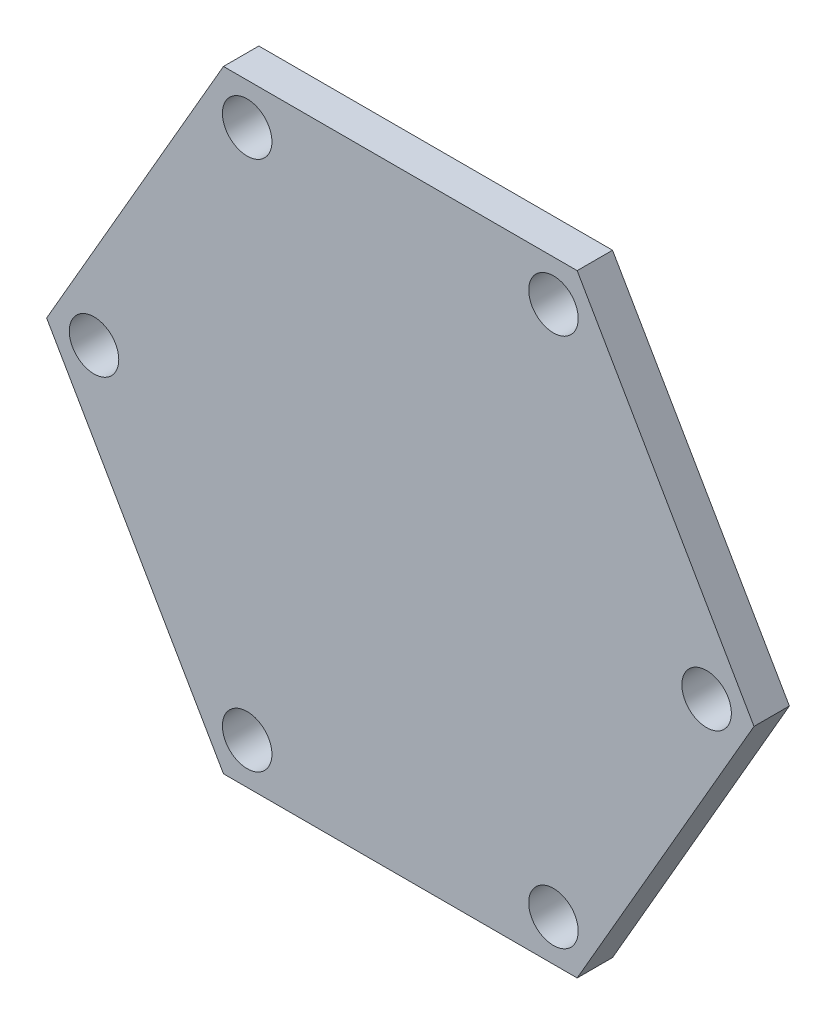
ISO-10303-21;
HEADER;
FILE_DESCRIPTION(('STEP AP214'),'2;1');
FILE_NAME('part.step','',(''),(''),'','','');
FILE_SCHEMA(('AUTOMOTIVE_DESIGN { 1 0 10303 214 1 1 1 1 }'));
ENDSEC;
DATA;
#1=APPLICATION_CONTEXT('core data for automotive mechanical design processes');
#2=APPLICATION_PROTOCOL_DEFINITION('international standard','automotive_design',2000,#1);
#3=PRODUCT_CONTEXT('',#1,'mechanical');
#4=PRODUCT('Part','Part','',(#3));
#5=PRODUCT_RELATED_PRODUCT_CATEGORY('part','',(#4));
#6=PRODUCT_DEFINITION_FORMATION('','',#4);
#7=PRODUCT_DEFINITION_CONTEXT('part definition',#1,'design');
#8=PRODUCT_DEFINITION('design','',#6,#7);
#9=PRODUCT_DEFINITION_SHAPE('','',#8);
#10=(LENGTH_UNIT() NAMED_UNIT(*) SI_UNIT(.MILLI.,.METRE.));
#11=(NAMED_UNIT(*) PLANE_ANGLE_UNIT() SI_UNIT($,.RADIAN.));
#12=(NAMED_UNIT(*) SI_UNIT($,.STERADIAN.) SOLID_ANGLE_UNIT());
#13=UNCERTAINTY_MEASURE_WITH_UNIT(LENGTH_MEASURE(1.E-05),#10,'distance_accuracy_value','');
#14=(GEOMETRIC_REPRESENTATION_CONTEXT(3) GLOBAL_UNCERTAINTY_ASSIGNED_CONTEXT((#13)) GLOBAL_UNIT_ASSIGNED_CONTEXT((#10,
#11,#12)) REPRESENTATION_CONTEXT('',''));
#15=CARTESIAN_POINT('',(0.,0.,0.));
#16=DIRECTION('',(0.,0.,1.));
#17=DIRECTION('',(1.,0.,0.));
#18=AXIS2_PLACEMENT_3D('',#15,#16,#17);
#19=CARTESIAN_POINT('',(0.,0.,10.));
#20=DIRECTION('',(0.,0.,1.));
#21=DIRECTION('',(1.,0.,0.));
#22=AXIS2_PLACEMENT_3D('',#19,#20,#21);
#23=PLANE('',#22);
#24=CARTESIAN_POINT('',(-43.3012701892219,-75.0000000000001,10.));
#25=DIRECTION('',(0.,0.,1.));
#26=DIRECTION('',(1.,0.,0.));
#27=AXIS2_PLACEMENT_3D('',#24,#25,#26);
#28=CIRCLE('',#27,7.);
#29=CARTESIAN_POINT('',(-36.3012701892219,-75.0000000000001,10.));
#30=VERTEX_POINT('',#29);
#31=EDGE_CURVE('E196',#30,#30,#28,.T.);
#32=ORIENTED_EDGE('',*,*,#31,.F.);
#33=EDGE_LOOP('',(#32));
#34=FACE_BOUND('',#33,.T.);
#35=CARTESIAN_POINT('',(86.6025403784439,0.,10.));
#36=DIRECTION('',(0.,0.,1.));
#37=DIRECTION('',(1.,0.,0.));
#38=AXIS2_PLACEMENT_3D('',#35,#36,#37);
#39=CIRCLE('',#38,7.);
#40=CARTESIAN_POINT('',(93.6025403784439,0.,10.));
#41=VERTEX_POINT('',#40);
#42=EDGE_CURVE('E208',#41,#41,#39,.T.);
#43=ORIENTED_EDGE('',*,*,#42,.F.);
#44=EDGE_LOOP('',(#43));
#45=FACE_BOUND('',#44,.T.);
#46=CARTESIAN_POINT('',(-43.301270189222,75.,10.));
#47=DIRECTION('',(0.,0.,1.));
#48=DIRECTION('',(1.,0.,0.));
#49=AXIS2_PLACEMENT_3D('',#46,#47,#48);
#50=CIRCLE('',#49,7.);
#51=CARTESIAN_POINT('',(-36.301270189222,75.,10.));
#52=VERTEX_POINT('',#51);
#53=EDGE_CURVE('E121',#52,#52,#50,.T.);
#54=ORIENTED_EDGE('',*,*,#53,.F.);
#55=EDGE_LOOP('',(#54));
#56=FACE_BOUND('',#55,.T.);
#57=DIRECTION('',(-0.5,0.866025403784438,0.));
#58=VECTOR('',#57,1.);
#59=CARTESIAN_POINT('',(100.,0.,10.));
#60=LINE('',#59,#58);
#61=CARTESIAN_POINT('',(100.,0.,10.));
#62=VERTEX_POINT('',#61);
#63=CARTESIAN_POINT('',(50.,86.6025403784439,10.));
#64=VERTEX_POINT('',#63);
#65=EDGE_CURVE('E128',#62,#64,#60,.T.);
#66=ORIENTED_EDGE('',*,*,#65,.T.);
#67=DIRECTION('',(-1.,0.,0.));
#68=VECTOR('',#67,1.);
#69=CARTESIAN_POINT('',(50.,86.6025403784439,10.));
#70=LINE('',#69,#68);
#71=CARTESIAN_POINT('',(-50.,86.6025403784439,10.));
#72=VERTEX_POINT('',#71);
#73=EDGE_CURVE('E86',#64,#72,#70,.T.);
#74=ORIENTED_EDGE('',*,*,#73,.T.);
#75=DIRECTION('',(-0.5,-0.866025403784439,0.));
#76=VECTOR('',#75,1.);
#77=CARTESIAN_POINT('',(-50.,86.6025403784439,10.));
#78=LINE('',#77,#76);
#79=CARTESIAN_POINT('',(-100.,0.,10.));
#80=VERTEX_POINT('',#79);
#81=EDGE_CURVE('E99',#72,#80,#78,.T.);
#82=ORIENTED_EDGE('',*,*,#81,.T.);
#83=DIRECTION('',(0.5,-0.866025403784438,0.));
#84=VECTOR('',#83,1.);
#85=CARTESIAN_POINT('',(-100.,0.,10.));
#86=LINE('',#85,#84);
#87=CARTESIAN_POINT('',(-50.,-86.6025403784439,10.));
#88=VERTEX_POINT('',#87);
#89=EDGE_CURVE('E93',#80,#88,#86,.T.);
#90=ORIENTED_EDGE('',*,*,#89,.T.);
#91=DIRECTION('',(1.,0.,0.));
#92=VECTOR('',#91,1.);
#93=CARTESIAN_POINT('',(-50.,-86.6025403784439,10.));
#94=LINE('',#93,#92);
#95=CARTESIAN_POINT('',(50.,-86.6025403784439,10.));
#96=VERTEX_POINT('',#95);
#97=EDGE_CURVE('E97',#88,#96,#94,.T.);
#98=ORIENTED_EDGE('',*,*,#97,.T.);
#99=DIRECTION('',(0.5,0.866025403784439,0.));
#100=VECTOR('',#99,1.);
#101=CARTESIAN_POINT('',(50.,-86.6025403784439,10.));
#102=LINE('',#101,#100);
#103=EDGE_CURVE('E49',#96,#62,#102,.T.);
#104=ORIENTED_EDGE('',*,*,#103,.T.);
#105=EDGE_LOOP('',(#66,#74,#82,#90,#98,#104));
#106=FACE_BOUND('',#105,.T.);
#107=CARTESIAN_POINT('',(43.3012701892219,75.,10.));
#108=DIRECTION('',(0.,0.,1.));
#109=DIRECTION('',(1.,0.,0.));
#110=AXIS2_PLACEMENT_3D('',#107,#108,#109);
#111=CIRCLE('',#110,7.);
#112=CARTESIAN_POINT('',(50.3012701892219,75.,10.));
#113=VERTEX_POINT('',#112);
#114=EDGE_CURVE('E214',#113,#113,#111,.T.);
#115=ORIENTED_EDGE('',*,*,#114,.F.);
#116=EDGE_LOOP('',(#115));
#117=FACE_BOUND('',#116,.T.);
#118=CARTESIAN_POINT('',(43.301270189222,-75.,10.));
#119=DIRECTION('',(0.,0.,1.));
#120=DIRECTION('',(1.,0.,0.));
#121=AXIS2_PLACEMENT_3D('',#118,#119,#120);
#122=CIRCLE('',#121,7.);
#123=CARTESIAN_POINT('',(50.301270189222,-75.,10.));
#124=VERTEX_POINT('',#123);
#125=EDGE_CURVE('E202',#124,#124,#122,.T.);
#126=ORIENTED_EDGE('',*,*,#125,.F.);
#127=EDGE_LOOP('',(#126));
#128=FACE_BOUND('',#127,.T.);
#129=CARTESIAN_POINT('',(-86.6025403784439,0.,10.));
#130=DIRECTION('',(0.,0.,1.));
#131=DIRECTION('',(1.,0.,0.));
#132=AXIS2_PLACEMENT_3D('',#129,#130,#131);
#133=CIRCLE('',#132,7.);
#134=CARTESIAN_POINT('',(-79.6025403784439,0.,10.));
#135=VERTEX_POINT('',#134);
#136=EDGE_CURVE('E187',#135,#135,#133,.T.);
#137=ORIENTED_EDGE('',*,*,#136,.F.);
#138=EDGE_LOOP('',(#137));
#139=FACE_BOUND('',#138,.T.);
#140=ADVANCED_FACE('F32',(#34,#45,#56,#106,#117,#128,#139),#23,.T.);
#141=CARTESIAN_POINT('',(0.,0.,0.));
#142=DIRECTION('',(0.,0.,1.));
#143=DIRECTION('',(1.,0.,0.));
#144=AXIS2_PLACEMENT_3D('',#141,#142,#143);
#145=PLANE('',#144);
#146=DIRECTION('',(-0.5,0.866025403784438,0.));
#147=VECTOR('',#146,1.);
#148=CARTESIAN_POINT('',(100.,0.,0.));
#149=LINE('',#148,#147);
#150=CARTESIAN_POINT('',(100.,0.,0.));
#151=VERTEX_POINT('',#150);
#152=CARTESIAN_POINT('',(50.,86.6025403784439,0.));
#153=VERTEX_POINT('',#152);
#154=EDGE_CURVE('E117',#151,#153,#149,.T.);
#155=ORIENTED_EDGE('',*,*,#154,.F.);
#156=DIRECTION('',(0.5,0.866025403784439,0.));
#157=VECTOR('',#156,1.);
#158=CARTESIAN_POINT('',(50.,-86.6025403784439,0.));
#159=LINE('',#158,#157);
#160=CARTESIAN_POINT('',(50.,-86.6025403784439,0.));
#161=VERTEX_POINT('',#160);
#162=EDGE_CURVE('E78',#161,#151,#159,.T.);
#163=ORIENTED_EDGE('',*,*,#162,.F.);
#164=DIRECTION('',(1.,0.,0.));
#165=VECTOR('',#164,1.);
#166=CARTESIAN_POINT('',(-50.,-86.6025403784439,0.));
#167=LINE('',#166,#165);
#168=CARTESIAN_POINT('',(-50.,-86.6025403784439,0.));
#169=VERTEX_POINT('',#168);
#170=EDGE_CURVE('E72',#169,#161,#167,.T.);
#171=ORIENTED_EDGE('',*,*,#170,.F.);
#172=DIRECTION('',(0.5,-0.866025403784438,0.));
#173=VECTOR('',#172,1.);
#174=CARTESIAN_POINT('',(-100.,0.,0.));
#175=LINE('',#174,#173);
#176=CARTESIAN_POINT('',(-100.,0.,0.));
#177=VERTEX_POINT('',#176);
#178=EDGE_CURVE('E107',#177,#169,#175,.T.);
#179=ORIENTED_EDGE('',*,*,#178,.F.);
#180=DIRECTION('',(-0.5,-0.866025403784439,0.));
#181=VECTOR('',#180,1.);
#182=CARTESIAN_POINT('',(-50.,86.6025403784439,0.));
#183=LINE('',#182,#181);
#184=CARTESIAN_POINT('',(-50.,86.6025403784439,0.));
#185=VERTEX_POINT('',#184);
#186=EDGE_CURVE('E123',#185,#177,#183,.T.);
#187=ORIENTED_EDGE('',*,*,#186,.F.);
#188=DIRECTION('',(-1.,0.,0.));
#189=VECTOR('',#188,1.);
#190=CARTESIAN_POINT('',(50.,86.6025403784439,0.));
#191=LINE('',#190,#189);
#192=EDGE_CURVE('E120',#153,#185,#191,.T.);
#193=ORIENTED_EDGE('',*,*,#192,.F.);
#194=EDGE_LOOP('',(#155,#163,#171,#179,#187,#193));
#195=FACE_BOUND('',#194,.T.);
#196=CARTESIAN_POINT('',(-43.301270189222,75.,0.));
#197=DIRECTION('',(0.,0.,1.));
#198=DIRECTION('',(1.,0.,0.));
#199=AXIS2_PLACEMENT_3D('',#196,#197,#198);
#200=CIRCLE('',#199,7.);
#201=CARTESIAN_POINT('',(-36.301270189222,75.,0.));
#202=VERTEX_POINT('',#201);
#203=EDGE_CURVE('E217',#202,#202,#200,.T.);
#204=ORIENTED_EDGE('',*,*,#203,.T.);
#205=EDGE_LOOP('',(#204));
#206=FACE_BOUND('',#205,.T.);
#207=CARTESIAN_POINT('',(43.3012701892219,75.,0.));
#208=DIRECTION('',(0.,0.,1.));
#209=DIRECTION('',(1.,0.,0.));
#210=AXIS2_PLACEMENT_3D('',#207,#208,#209);
#211=CIRCLE('',#210,7.);
#212=CARTESIAN_POINT('',(50.3012701892219,75.,0.));
#213=VERTEX_POINT('',#212);
#214=EDGE_CURVE('E211',#213,#213,#211,.T.);
#215=ORIENTED_EDGE('',*,*,#214,.T.);
#216=EDGE_LOOP('',(#215));
#217=FACE_BOUND('',#216,.T.);
#218=CARTESIAN_POINT('',(86.6025403784439,0.,0.));
#219=DIRECTION('',(0.,0.,1.));
#220=DIRECTION('',(1.,0.,0.));
#221=AXIS2_PLACEMENT_3D('',#218,#219,#220);
#222=CIRCLE('',#221,7.);
#223=CARTESIAN_POINT('',(93.6025403784439,0.,0.));
#224=VERTEX_POINT('',#223);
#225=EDGE_CURVE('E205',#224,#224,#222,.T.);
#226=ORIENTED_EDGE('',*,*,#225,.T.);
#227=EDGE_LOOP('',(#226));
#228=FACE_BOUND('',#227,.T.);
#229=CARTESIAN_POINT('',(43.301270189222,-75.,0.));
#230=DIRECTION('',(0.,0.,1.));
#231=DIRECTION('',(1.,0.,0.));
#232=AXIS2_PLACEMENT_3D('',#229,#230,#231);
#233=CIRCLE('',#232,7.);
#234=CARTESIAN_POINT('',(50.301270189222,-75.,0.));
#235=VERTEX_POINT('',#234);
#236=EDGE_CURVE('E199',#235,#235,#233,.T.);
#237=ORIENTED_EDGE('',*,*,#236,.T.);
#238=EDGE_LOOP('',(#237));
#239=FACE_BOUND('',#238,.T.);
#240=CARTESIAN_POINT('',(-43.3012701892219,-75.0000000000001,0.));
#241=DIRECTION('',(0.,0.,1.));
#242=DIRECTION('',(1.,0.,0.));
#243=AXIS2_PLACEMENT_3D('',#240,#241,#242);
#244=CIRCLE('',#243,7.);
#245=CARTESIAN_POINT('',(-36.3012701892219,-75.0000000000001,0.));
#246=VERTEX_POINT('',#245);
#247=EDGE_CURVE('E193',#246,#246,#244,.T.);
#248=ORIENTED_EDGE('',*,*,#247,.T.);
#249=EDGE_LOOP('',(#248));
#250=FACE_BOUND('',#249,.T.);
#251=CARTESIAN_POINT('',(-86.6025403784439,0.,0.));
#252=DIRECTION('',(0.,0.,1.));
#253=DIRECTION('',(1.,0.,0.));
#254=AXIS2_PLACEMENT_3D('',#251,#252,#253);
#255=CIRCLE('',#254,7.);
#256=CARTESIAN_POINT('',(-79.6025403784439,0.,0.));
#257=VERTEX_POINT('',#256);
#258=EDGE_CURVE('E190',#257,#257,#255,.T.);
#259=ORIENTED_EDGE('',*,*,#258,.T.);
#260=EDGE_LOOP('',(#259));
#261=FACE_BOUND('',#260,.T.);
#262=ADVANCED_FACE('F137',(#195,#206,#217,#228,#239,#250,#261),#145,.F.);
#263=CARTESIAN_POINT('',(100.,0.,10.));
#264=DIRECTION('',(-0.866025403784438,-0.5,0.));
#265=DIRECTION('',(0.5,-0.866025403784438,0.));
#266=AXIS2_PLACEMENT_3D('',#263,#264,#265);
#267=PLANE('',#266);
#268=ORIENTED_EDGE('',*,*,#154,.T.);
#269=DIRECTION('',(0.,0.,-1.));
#270=VECTOR('',#269,1.);
#271=CARTESIAN_POINT('',(50.,86.6025403784439,10.));
#272=LINE('',#271,#270);
#273=EDGE_CURVE('E11',#64,#153,#272,.T.);
#274=ORIENTED_EDGE('',*,*,#273,.F.);
#275=ORIENTED_EDGE('',*,*,#65,.F.);
#276=DIRECTION('',(0.,0.,-1.));
#277=VECTOR('',#276,1.);
#278=CARTESIAN_POINT('',(100.,0.,10.));
#279=LINE('',#278,#277);
#280=EDGE_CURVE('E113',#62,#151,#279,.T.);
#281=ORIENTED_EDGE('',*,*,#280,.T.);
#282=EDGE_LOOP('',(#268,#274,#275,#281));
#283=FACE_BOUND('',#282,.T.);
#284=ADVANCED_FACE('F34',(#283),#267,.F.);
#285=CARTESIAN_POINT('',(50.,86.6025403784439,10.));
#286=DIRECTION('',(0.,-1.,0.));
#287=DIRECTION('',(0.,0.,-1.));
#288=AXIS2_PLACEMENT_3D('',#285,#286,#287);
#289=PLANE('',#288);
#290=ORIENTED_EDGE('',*,*,#192,.T.);
#291=DIRECTION('',(0.,0.,-1.));
#292=VECTOR('',#291,1.);
#293=CARTESIAN_POINT('',(-50.,86.6025403784439,10.));
#294=LINE('',#293,#292);
#295=EDGE_CURVE('E41',#72,#185,#294,.T.);
#296=ORIENTED_EDGE('',*,*,#295,.F.);
#297=ORIENTED_EDGE('',*,*,#73,.F.);
#298=ORIENTED_EDGE('',*,*,#273,.T.);
#299=EDGE_LOOP('',(#290,#296,#297,#298));
#300=FACE_BOUND('',#299,.T.);
#301=ADVANCED_FACE('F293',(#300),#289,.F.);
#302=CARTESIAN_POINT('',(-50.,86.6025403784439,10.));
#303=DIRECTION('',(0.866025403784439,-0.5,0.));
#304=DIRECTION('',(0.5,0.866025403784439,0.));
#305=AXIS2_PLACEMENT_3D('',#302,#303,#304);
#306=PLANE('',#305);
#307=ORIENTED_EDGE('',*,*,#186,.T.);
#308=DIRECTION('',(0.,0.,-1.));
#309=VECTOR('',#308,1.);
#310=CARTESIAN_POINT('',(-100.,0.,10.));
#311=LINE('',#310,#309);
#312=EDGE_CURVE('E108',#80,#177,#311,.T.);
#313=ORIENTED_EDGE('',*,*,#312,.F.);
#314=ORIENTED_EDGE('',*,*,#81,.F.);
#315=ORIENTED_EDGE('',*,*,#295,.T.);
#316=EDGE_LOOP('',(#307,#313,#314,#315));
#317=FACE_BOUND('',#316,.T.);
#318=ADVANCED_FACE('F134',(#317),#306,.F.);
#319=CARTESIAN_POINT('',(-100.,0.,10.));
#320=DIRECTION('',(0.866025403784439,0.5,0.));
#321=DIRECTION('',(-0.5,0.866025403784439,0.));
#322=AXIS2_PLACEMENT_3D('',#319,#320,#321);
#323=PLANE('',#322);
#324=ORIENTED_EDGE('',*,*,#178,.T.);
#325=DIRECTION('',(0.,0.,-1.));
#326=VECTOR('',#325,1.);
#327=CARTESIAN_POINT('',(-50.,-86.6025403784439,10.));
#328=LINE('',#327,#326);
#329=EDGE_CURVE('E104',#88,#169,#328,.T.);
#330=ORIENTED_EDGE('',*,*,#329,.F.);
#331=ORIENTED_EDGE('',*,*,#89,.F.);
#332=ORIENTED_EDGE('',*,*,#312,.T.);
#333=EDGE_LOOP('',(#324,#330,#331,#332));
#334=FACE_BOUND('',#333,.T.);
#335=ADVANCED_FACE('F105',(#334),#323,.F.);
#336=CARTESIAN_POINT('',(-50.,-86.6025403784439,10.));
#337=DIRECTION('',(0.,1.,0.));
#338=DIRECTION('',(-1.,0.,0.));
#339=AXIS2_PLACEMENT_3D('',#336,#337,#338);
#340=PLANE('',#339);
#341=ORIENTED_EDGE('',*,*,#170,.T.);
#342=DIRECTION('',(0.,0.,-1.));
#343=VECTOR('',#342,1.);
#344=CARTESIAN_POINT('',(50.,-86.6025403784439,10.));
#345=LINE('',#344,#343);
#346=EDGE_CURVE('E109',#96,#161,#345,.T.);
#347=ORIENTED_EDGE('',*,*,#346,.F.);
#348=ORIENTED_EDGE('',*,*,#97,.F.);
#349=ORIENTED_EDGE('',*,*,#329,.T.);
#350=EDGE_LOOP('',(#341,#347,#348,#349));
#351=FACE_BOUND('',#350,.T.);
#352=ADVANCED_FACE('F111',(#351),#340,.F.);
#353=CARTESIAN_POINT('',(50.,-86.6025403784439,10.));
#354=DIRECTION('',(-0.866025403784439,0.5,0.));
#355=DIRECTION('',(-0.5,-0.866025403784439,0.));
#356=AXIS2_PLACEMENT_3D('',#353,#354,#355);
#357=PLANE('',#356);
#358=ORIENTED_EDGE('',*,*,#162,.T.);
#359=ORIENTED_EDGE('',*,*,#280,.F.);
#360=ORIENTED_EDGE('',*,*,#103,.F.);
#361=ORIENTED_EDGE('',*,*,#346,.T.);
#362=EDGE_LOOP('',(#358,#359,#360,#361));
#363=FACE_BOUND('',#362,.T.);
#364=ADVANCED_FACE('F142',(#363),#357,.F.);
#365=CARTESIAN_POINT('',(-43.301270189222,75.,10.));
#366=DIRECTION('',(0.,0.,-1.));
#367=DIRECTION('',(-1.,0.,0.));
#368=AXIS2_PLACEMENT_3D('',#365,#366,#367);
#369=CYLINDRICAL_SURFACE('',#368,7.);
#370=ORIENTED_EDGE('',*,*,#53,.T.);
#371=EDGE_LOOP('',(#370));
#372=FACE_BOUND('',#371,.T.);
#373=ORIENTED_EDGE('',*,*,#203,.F.);
#374=EDGE_LOOP('',(#373));
#375=FACE_BOUND('',#374,.T.);
#376=ADVANCED_FACE('F144',(#372,#375),#369,.F.);
#377=CARTESIAN_POINT('',(43.3012701892219,75.,10.));
#378=DIRECTION('',(0.,0.,-1.));
#379=DIRECTION('',(-1.,0.,0.));
#380=AXIS2_PLACEMENT_3D('',#377,#378,#379);
#381=CYLINDRICAL_SURFACE('',#380,7.);
#382=ORIENTED_EDGE('',*,*,#114,.T.);
#383=EDGE_LOOP('',(#382));
#384=FACE_BOUND('',#383,.T.);
#385=ORIENTED_EDGE('',*,*,#214,.F.);
#386=EDGE_LOOP('',(#385));
#387=FACE_BOUND('',#386,.T.);
#388=ADVANCED_FACE('F150',(#384,#387),#381,.F.);
#389=CARTESIAN_POINT('',(86.6025403784439,0.,10.));
#390=DIRECTION('',(0.,0.,-1.));
#391=DIRECTION('',(-1.,0.,0.));
#392=AXIS2_PLACEMENT_3D('',#389,#390,#391);
#393=CYLINDRICAL_SURFACE('',#392,7.);
#394=ORIENTED_EDGE('',*,*,#42,.T.);
#395=EDGE_LOOP('',(#394));
#396=FACE_BOUND('',#395,.T.);
#397=ORIENTED_EDGE('',*,*,#225,.F.);
#398=EDGE_LOOP('',(#397));
#399=FACE_BOUND('',#398,.T.);
#400=ADVANCED_FACE('F166',(#396,#399),#393,.F.);
#401=CARTESIAN_POINT('',(43.301270189222,-75.,10.));
#402=DIRECTION('',(0.,0.,-1.));
#403=DIRECTION('',(-1.,0.,0.));
#404=AXIS2_PLACEMENT_3D('',#401,#402,#403);
#405=CYLINDRICAL_SURFACE('',#404,7.);
#406=ORIENTED_EDGE('',*,*,#125,.T.);
#407=EDGE_LOOP('',(#406));
#408=FACE_BOUND('',#407,.T.);
#409=ORIENTED_EDGE('',*,*,#236,.F.);
#410=EDGE_LOOP('',(#409));
#411=FACE_BOUND('',#410,.T.);
#412=ADVANCED_FACE('F170',(#408,#411),#405,.F.);
#413=CARTESIAN_POINT('',(-43.3012701892219,-75.0000000000001,10.));
#414=DIRECTION('',(0.,0.,-1.));
#415=DIRECTION('',(-1.,0.,0.));
#416=AXIS2_PLACEMENT_3D('',#413,#414,#415);
#417=CYLINDRICAL_SURFACE('',#416,7.);
#418=ORIENTED_EDGE('',*,*,#31,.T.);
#419=EDGE_LOOP('',(#418));
#420=FACE_BOUND('',#419,.T.);
#421=ORIENTED_EDGE('',*,*,#247,.F.);
#422=EDGE_LOOP('',(#421));
#423=FACE_BOUND('',#422,.T.);
#424=ADVANCED_FACE('F174',(#420,#423),#417,.F.);
#425=CARTESIAN_POINT('',(-86.6025403784439,0.,10.));
#426=DIRECTION('',(0.,0.,-1.));
#427=DIRECTION('',(-1.,0.,0.));
#428=AXIS2_PLACEMENT_3D('',#425,#426,#427);
#429=CYLINDRICAL_SURFACE('',#428,7.);
#430=ORIENTED_EDGE('',*,*,#136,.T.);
#431=EDGE_LOOP('',(#430));
#432=FACE_BOUND('',#431,.T.);
#433=ORIENTED_EDGE('',*,*,#258,.F.);
#434=EDGE_LOOP('',(#433));
#435=FACE_BOUND('',#434,.T.);
#436=ADVANCED_FACE('F178',(#432,#435),#429,.F.);
#437=CLOSED_SHELL('',(#140,#262,#284,#301,#318,#335,#352,#364,#376,#388,#400,#412,#424,#436));
#438=MANIFOLD_SOLID_BREP('B2',#437);
#439=ADVANCED_BREP_SHAPE_REPRESENTATION('',(#18,#438),#14);
#440=SHAPE_DEFINITION_REPRESENTATION(#9,#439);
ENDSEC;
END-ISO-10303-21;
